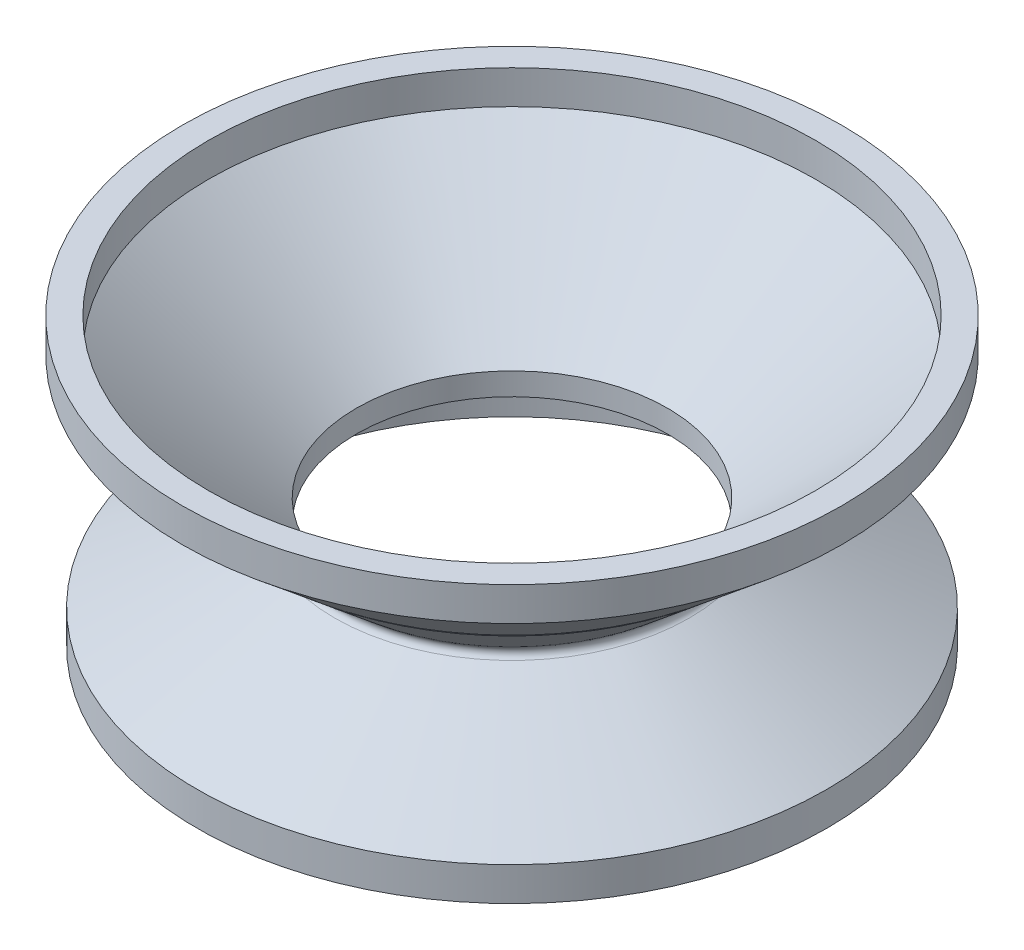
ISO-10303-21;
HEADER;
FILE_DESCRIPTION(('STEP AP214'),'2;1');
FILE_NAME('part.step','',(''),(''),'','','');
FILE_SCHEMA(('AUTOMOTIVE_DESIGN { 1 0 10303 214 1 1 1 1 }'));
ENDSEC;
DATA;
#1=APPLICATION_CONTEXT('core data for automotive mechanical design processes');
#2=APPLICATION_PROTOCOL_DEFINITION('international standard','automotive_design',2000,#1);
#3=PRODUCT_CONTEXT('',#1,'mechanical');
#4=PRODUCT('Part','Part','',(#3));
#5=PRODUCT_RELATED_PRODUCT_CATEGORY('part','',(#4));
#6=PRODUCT_DEFINITION_FORMATION('','',#4);
#7=PRODUCT_DEFINITION_CONTEXT('part definition',#1,'design');
#8=PRODUCT_DEFINITION('design','',#6,#7);
#9=PRODUCT_DEFINITION_SHAPE('','',#8);
#10=(LENGTH_UNIT() NAMED_UNIT(*) SI_UNIT(.MILLI.,.METRE.));
#11=(NAMED_UNIT(*) PLANE_ANGLE_UNIT() SI_UNIT($,.RADIAN.));
#12=(NAMED_UNIT(*) SI_UNIT($,.STERADIAN.) SOLID_ANGLE_UNIT());
#13=UNCERTAINTY_MEASURE_WITH_UNIT(LENGTH_MEASURE(1.E-05),#10,'distance_accuracy_value','');
#14=(GEOMETRIC_REPRESENTATION_CONTEXT(3) GLOBAL_UNCERTAINTY_ASSIGNED_CONTEXT((#13)) GLOBAL_UNIT_ASSIGNED_CONTEXT((#10,
#11,#12)) REPRESENTATION_CONTEXT('',''));
#15=CARTESIAN_POINT('',(0.,0.,0.));
#16=DIRECTION('',(0.,0.,1.));
#17=DIRECTION('',(1.,0.,0.));
#18=AXIS2_PLACEMENT_3D('',#15,#16,#17);
#19=CARTESIAN_POINT('',(10.6844770387406,0.,0.));
#20=DIRECTION('',(0.,-1.,0.));
#21=DIRECTION('',(1.,0.,0.));
#22=AXIS2_PLACEMENT_3D('',#19,#20,#21);
#23=CONICAL_SURFACE('',#22,10.0216950861066,1.0471975511966);
#24=CARTESIAN_POINT('',(10.6844770387406,-0.285629601348422,0.));
#25=DIRECTION('',(0.,-1.,0.));
#26=DIRECTION('',(1.,0.,0.));
#27=AXIS2_PLACEMENT_3D('',#24,#25,#26);
#28=CIRCLE('',#27,10.5164200677877);
#29=CARTESIAN_POINT('',(21.2008971065283,-0.28562960134842,0.));
#30=VERTEX_POINT('',#29);
#31=EDGE_CURVE('E11',#30,#30,#28,.T.);
#32=ORIENTED_EDGE('',*,*,#31,.T.);
#33=EDGE_LOOP('',(#32));
#34=FACE_BOUND('',#33,.T.);
#35=CARTESIAN_POINT('',(10.6844770387406,-5.,0.));
#36=DIRECTION('',(0.,-1.,0.));
#37=DIRECTION('',(1.,0.,0.));
#38=AXIS2_PLACEMENT_3D('',#35,#36,#37);
#39=CIRCLE('',#38,18.6819491239511);
#40=CARTESIAN_POINT('',(29.3664261626917,-5.,0.));
#41=VERTEX_POINT('',#40);
#42=EDGE_CURVE('E102',#41,#41,#39,.T.);
#43=ORIENTED_EDGE('',*,*,#42,.F.);
#44=EDGE_LOOP('',(#43));
#45=FACE_BOUND('',#44,.T.);
#46=ADVANCED_FACE('F45',(#34,#45),#23,.T.);
#47=CARTESIAN_POINT('',(10.6844770387406,3.9344166980199,0.));
#48=DIRECTION('',(0.,1.,0.));
#49=DIRECTION('',(-1.,0.,0.));
#50=AXIS2_PLACEMENT_3D('',#47,#48,#49);
#51=CONICAL_SURFACE('',#50,14.7105503207345,0.87266462599717);
#52=CARTESIAN_POINT('',(10.6844770387406,0.367198337412947,0.));
#53=DIRECTION('',(0.,1.,0.));
#54=DIRECTION('',(-1.,0.,0.));
#55=AXIS2_PLACEMENT_3D('',#52,#53,#54);
#56=CIRCLE('',#55,10.4593050239131);
#57=CARTESIAN_POINT('',(0.22517201482746,0.367198337412946,0.));
#58=VERTEX_POINT('',#57);
#59=EDGE_CURVE('E53',#58,#58,#56,.T.);
#60=ORIENTED_EDGE('',*,*,#59,.T.);
#61=EDGE_LOOP('',(#60));
#62=FACE_BOUND('',#61,.T.);
#63=CARTESIAN_POINT('',(10.6844770387406,3.9344166980199,0.));
#64=DIRECTION('',(0.,1.,0.));
#65=DIRECTION('',(-1.,0.,0.));
#66=AXIS2_PLACEMENT_3D('',#63,#64,#65);
#67=CIRCLE('',#66,14.7105503207345);
#68=CARTESIAN_POINT('',(-4.02607328199395,3.9344166980199,0.));
#69=VERTEX_POINT('',#68);
#70=EDGE_CURVE('E58',#69,#69,#67,.T.);
#71=ORIENTED_EDGE('',*,*,#70,.F.);
#72=EDGE_LOOP('',(#71));
#73=FACE_BOUND('',#72,.T.);
#74=ADVANCED_FACE('F134',(#62,#73),#51,.T.);
#75=CARTESIAN_POINT('',(10.6844770387406,7.60901803281973,0.));
#76=DIRECTION('',(0.,1.,0.));
#77=DIRECTION('',(-1.,0.,0.));
#78=AXIS2_PLACEMENT_3D('',#75,#76,#77);
#79=CYLINDRICAL_SURFACE('',#78,14.7105503207345);
#80=ORIENTED_EDGE('',*,*,#70,.T.);
#81=EDGE_LOOP('',(#80));
#82=FACE_BOUND('',#81,.T.);
#83=CARTESIAN_POINT('',(10.6844770387406,4.19549815588635,0.));
#84=DIRECTION('',(0.,1.,0.));
#85=DIRECTION('',(-1.,0.,0.));
#86=AXIS2_PLACEMENT_3D('',#83,#84,#85);
#87=CIRCLE('',#86,14.7105503207345);
#88=CARTESIAN_POINT('',(-4.02607328199395,4.19549815588635,0.));
#89=VERTEX_POINT('',#88);
#90=EDGE_CURVE('E63',#89,#89,#87,.T.);
#91=ORIENTED_EDGE('',*,*,#90,.F.);
#92=EDGE_LOOP('',(#91));
#93=FACE_BOUND('',#92,.T.);
#94=ADVANCED_FACE('F139',(#82,#93),#79,.T.);
#95=CARTESIAN_POINT('',(-4.33721804736603,4.19549815588635,0.));
#96=DIRECTION('',(0.,-1.,0.));
#97=DIRECTION('',(1.,0.,0.));
#98=AXIS2_PLACEMENT_3D('',#95,#96,#97);
#99=PLANE('',#98);
#100=ORIENTED_EDGE('',*,*,#90,.T.);
#101=EDGE_LOOP('',(#100));
#102=FACE_BOUND('',#101,.T.);
#103=CARTESIAN_POINT('',(10.6844770387406,4.19549815588635,0.));
#104=DIRECTION('',(0.,1.,0.));
#105=DIRECTION('',(-1.,0.,0.));
#106=AXIS2_PLACEMENT_3D('',#103,#104,#105);
#107=CIRCLE('',#106,15.0216950861066);
#108=CARTESIAN_POINT('',(-4.33721804736603,4.19549815588635,0.));
#109=VERTEX_POINT('',#108);
#110=EDGE_CURVE('E69',#109,#109,#107,.T.);
#111=ORIENTED_EDGE('',*,*,#110,.F.);
#112=EDGE_LOOP('',(#111));
#113=FACE_BOUND('',#112,.T.);
#114=ADVANCED_FACE('F145',(#102,#113),#99,.T.);
#115=CARTESIAN_POINT('',(10.6844770387406,8.,0.));
#116=DIRECTION('',(0.,1.,0.));
#117=DIRECTION('',(-1.,0.,0.));
#118=AXIS2_PLACEMENT_3D('',#115,#116,#117);
#119=CONICAL_SURFACE('',#118,19.5557238268604,0.87266462599717);
#120=ORIENTED_EDGE('',*,*,#110,.T.);
#121=EDGE_LOOP('',(#120));
#122=FACE_BOUND('',#121,.T.);
#123=CARTESIAN_POINT('',(10.6844770387406,8.,0.));
#124=DIRECTION('',(0.,1.,0.));
#125=DIRECTION('',(-1.,0.,0.));
#126=AXIS2_PLACEMENT_3D('',#123,#124,#125);
#127=CIRCLE('',#126,19.5557238268604);
#128=CARTESIAN_POINT('',(-8.87124678811982,8.,0.));
#129=VERTEX_POINT('',#128);
#130=EDGE_CURVE('E73',#129,#129,#127,.T.);
#131=ORIENTED_EDGE('',*,*,#130,.F.);
#132=EDGE_LOOP('',(#131));
#133=FACE_BOUND('',#132,.T.);
#134=ADVANCED_FACE('F149',(#122,#133),#119,.T.);
#135=CARTESIAN_POINT('',(10.6844770387406,0.634127584390457,0.));
#136=DIRECTION('',(0.,1.,0.));
#137=DIRECTION('',(-1.,0.,0.));
#138=AXIS2_PLACEMENT_3D('',#135,#136,#137);
#139=CONICAL_SURFACE('',#138,9.22169508610663,0.872664625997171);
#140=CARTESIAN_POINT('',(10.6844770387406,8.,0.));
#141=DIRECTION('',(0.,1.,0.));
#142=DIRECTION('',(-1.,0.,0.));
#143=AXIS2_PLACEMENT_3D('',#140,#141,#142);
#144=CIRCLE('',#143,18.);
#145=CARTESIAN_POINT('',(-7.3155229612594,8.,0.));
#146=VERTEX_POINT('',#145);
#147=EDGE_CURVE('E94',#146,#146,#144,.T.);
#148=ORIENTED_EDGE('',*,*,#147,.T.);
#149=EDGE_LOOP('',(#148));
#150=FACE_BOUND('',#149,.T.);
#151=CARTESIAN_POINT('',(10.6844770387406,0.634127584390457,0.));
#152=DIRECTION('',(0.,1.,0.));
#153=DIRECTION('',(-1.,0.,0.));
#154=AXIS2_PLACEMENT_3D('',#151,#152,#153);
#155=CIRCLE('',#154,9.22169508610663);
#156=CARTESIAN_POINT('',(1.46278195263397,0.634127584390456,0.));
#157=VERTEX_POINT('',#156);
#158=EDGE_CURVE('E77',#157,#157,#155,.T.);
#159=ORIENTED_EDGE('',*,*,#158,.F.);
#160=EDGE_LOOP('',(#159));
#161=FACE_BOUND('',#160,.T.);
#162=ADVANCED_FACE('F153',(#150,#161),#139,.F.);
#163=CARTESIAN_POINT('',(10.6844770387406,7.60901803281973,0.));
#164=DIRECTION('',(0.,1.,0.));
#165=DIRECTION('',(-1.,0.,0.));
#166=AXIS2_PLACEMENT_3D('',#163,#164,#165);
#167=CYLINDRICAL_SURFACE('',#166,9.22169508610663);
#168=ORIENTED_EDGE('',*,*,#158,.T.);
#169=EDGE_LOOP('',(#168));
#170=FACE_BOUND('',#169,.T.);
#171=CARTESIAN_POINT('',(10.6844770387406,-0.692820323027552,0.));
#172=DIRECTION('',(0.,1.,0.));
#173=DIRECTION('',(-1.,0.,0.));
#174=AXIS2_PLACEMENT_3D('',#171,#172,#173);
#175=CIRCLE('',#174,9.22169508610663);
#176=CARTESIAN_POINT('',(1.46278195263397,-0.692820323027553,0.));
#177=VERTEX_POINT('',#176);
#178=EDGE_CURVE('E81',#177,#177,#175,.T.);
#179=ORIENTED_EDGE('',*,*,#178,.F.);
#180=EDGE_LOOP('',(#179));
#181=FACE_BOUND('',#180,.T.);
#182=ADVANCED_FACE('F157',(#170,#181),#167,.F.);
#183=CARTESIAN_POINT('',(10.6844770387406,-5.,0.));
#184=DIRECTION('',(0.,-1.,0.));
#185=DIRECTION('',(1.,0.,0.));
#186=AXIS2_PLACEMENT_3D('',#183,#184,#185);
#187=CONICAL_SURFACE('',#186,16.6819491239511,1.0471975511966);
#188=ORIENTED_EDGE('',*,*,#178,.T.);
#189=EDGE_LOOP('',(#188));
#190=FACE_BOUND('',#189,.T.);
#191=CARTESIAN_POINT('',(10.6844770387406,-5.,0.));
#192=DIRECTION('',(0.,1.,0.));
#193=DIRECTION('',(-1.,0.,0.));
#194=AXIS2_PLACEMENT_3D('',#191,#192,#193);
#195=CIRCLE('',#194,16.6819491239511);
#196=CARTESIAN_POINT('',(-5.99747208521052,-5.,0.));
#197=VERTEX_POINT('',#196);
#198=EDGE_CURVE('E85',#197,#197,#195,.T.);
#199=ORIENTED_EDGE('',*,*,#198,.F.);
#200=EDGE_LOOP('',(#199));
#201=FACE_BOUND('',#200,.T.);
#202=ADVANCED_FACE('F161',(#190,#201),#187,.F.);
#203=CARTESIAN_POINT('',(10.6844770387406,0.0607805601653547,0.));
#204=DIRECTION('',(0.,1.,0.));
#205=DIRECTION('',(-1.,0.,0.));
#206=AXIS2_PLACEMENT_3D('',#203,#204,#205);
#207=TOROIDAL_SURFACE('',#206,10.7164200677877,0.4);
#208=ORIENTED_EDGE('',*,*,#31,.F.);
#209=EDGE_LOOP('',(#208));
#210=FACE_BOUND('',#209,.T.);
#211=ORIENTED_EDGE('',*,*,#59,.F.);
#212=EDGE_LOOP('',(#211));
#213=FACE_BOUND('',#212,.T.);
#214=ADVANCED_FACE('F47',(#210,#213),#207,.F.);
#215=CARTESIAN_POINT('',(10.6844770387406,10.,0.));
#216=DIRECTION('',(0.,1.,0.));
#217=DIRECTION('',(-1.,0.,0.));
#218=AXIS2_PLACEMENT_3D('',#215,#216,#217);
#219=PLANE('',#218);
#220=CARTESIAN_POINT('',(10.6844770387406,10.,0.));
#221=DIRECTION('',(0.,1.,0.));
#222=DIRECTION('',(-1.,0.,0.));
#223=AXIS2_PLACEMENT_3D('',#220,#221,#222);
#224=CIRCLE('',#223,19.5557238268604);
#225=CARTESIAN_POINT('',(-8.87124678811983,10.,0.));
#226=VERTEX_POINT('',#225);
#227=EDGE_CURVE('E89',#226,#226,#224,.T.);
#228=ORIENTED_EDGE('',*,*,#227,.T.);
#229=EDGE_LOOP('',(#228));
#230=FACE_BOUND('',#229,.T.);
#231=CARTESIAN_POINT('',(10.6844770387406,10.,0.));
#232=DIRECTION('',(0.,1.,0.));
#233=DIRECTION('',(-1.,0.,0.));
#234=AXIS2_PLACEMENT_3D('',#231,#232,#233);
#235=CIRCLE('',#234,18.);
#236=CARTESIAN_POINT('',(-7.3155229612594,10.,0.));
#237=VERTEX_POINT('',#236);
#238=EDGE_CURVE('E93',#237,#237,#235,.T.);
#239=ORIENTED_EDGE('',*,*,#238,.F.);
#240=EDGE_LOOP('',(#239));
#241=FACE_BOUND('',#240,.T.);
#242=ADVANCED_FACE('F167',(#230,#241),#219,.T.);
#243=CARTESIAN_POINT('',(10.6844770387406,10.,0.));
#244=DIRECTION('',(0.,-1.,0.));
#245=DIRECTION('',(1.,0.,0.));
#246=AXIS2_PLACEMENT_3D('',#243,#244,#245);
#247=CYLINDRICAL_SURFACE('',#246,19.5557238268604);
#248=ORIENTED_EDGE('',*,*,#227,.F.);
#249=EDGE_LOOP('',(#248));
#250=FACE_BOUND('',#249,.T.);
#251=ORIENTED_EDGE('',*,*,#130,.T.);
#252=EDGE_LOOP('',(#251));
#253=FACE_BOUND('',#252,.T.);
#254=ADVANCED_FACE('F129',(#250,#253),#247,.T.);
#255=CARTESIAN_POINT('',(10.6844770387406,10.,0.));
#256=DIRECTION('',(0.,-1.,0.));
#257=DIRECTION('',(1.,0.,0.));
#258=AXIS2_PLACEMENT_3D('',#255,#256,#257);
#259=CYLINDRICAL_SURFACE('',#258,18.);
#260=ORIENTED_EDGE('',*,*,#238,.T.);
#261=EDGE_LOOP('',(#260));
#262=FACE_BOUND('',#261,.T.);
#263=ORIENTED_EDGE('',*,*,#147,.F.);
#264=EDGE_LOOP('',(#263));
#265=FACE_BOUND('',#264,.T.);
#266=ADVANCED_FACE('F120',(#262,#265),#259,.F.);
#267=CARTESIAN_POINT('',(10.6844770387406,-6.99999999999999,0.));
#268=DIRECTION('',(0.,-1.,0.));
#269=DIRECTION('',(1.,0.,0.));
#270=AXIS2_PLACEMENT_3D('',#267,#268,#269);
#271=PLANE('',#270);
#272=CARTESIAN_POINT('',(10.6844770387406,-6.99999999999999,0.));
#273=DIRECTION('',(0.,-1.,0.));
#274=DIRECTION('',(1.,0.,0.));
#275=AXIS2_PLACEMENT_3D('',#272,#273,#274);
#276=CIRCLE('',#275,18.6819491239511);
#277=CARTESIAN_POINT('',(29.3664261626917,-6.99999999999999,0.));
#278=VERTEX_POINT('',#277);
#279=EDGE_CURVE('E98',#278,#278,#276,.T.);
#280=ORIENTED_EDGE('',*,*,#279,.T.);
#281=EDGE_LOOP('',(#280));
#282=FACE_BOUND('',#281,.T.);
#283=CARTESIAN_POINT('',(10.6844770387406,-6.99999999999999,0.));
#284=DIRECTION('',(0.,-1.,0.));
#285=DIRECTION('',(1.,0.,0.));
#286=AXIS2_PLACEMENT_3D('',#283,#284,#285);
#287=CIRCLE('',#286,16.6819491239511);
#288=CARTESIAN_POINT('',(27.3664261626917,-6.99999999999999,0.));
#289=VERTEX_POINT('',#288);
#290=EDGE_CURVE('E106',#289,#289,#287,.T.);
#291=ORIENTED_EDGE('',*,*,#290,.F.);
#292=EDGE_LOOP('',(#291));
#293=FACE_BOUND('',#292,.T.);
#294=ADVANCED_FACE('F117',(#282,#293),#271,.T.);
#295=CARTESIAN_POINT('',(10.6844770387406,-6.99999999999999,0.));
#296=DIRECTION('',(0.,1.,0.));
#297=DIRECTION('',(-1.,0.,0.));
#298=AXIS2_PLACEMENT_3D('',#295,#296,#297);
#299=CYLINDRICAL_SURFACE('',#298,18.6819491239511);
#300=ORIENTED_EDGE('',*,*,#279,.F.);
#301=EDGE_LOOP('',(#300));
#302=FACE_BOUND('',#301,.T.);
#303=ORIENTED_EDGE('',*,*,#42,.T.);
#304=EDGE_LOOP('',(#303));
#305=FACE_BOUND('',#304,.T.);
#306=ADVANCED_FACE('F119',(#302,#305),#299,.T.);
#307=CARTESIAN_POINT('',(10.6844770387406,-6.99999999999999,0.));
#308=DIRECTION('',(0.,1.,0.));
#309=DIRECTION('',(-1.,0.,0.));
#310=AXIS2_PLACEMENT_3D('',#307,#308,#309);
#311=CYLINDRICAL_SURFACE('',#310,16.6819491239511);
#312=ORIENTED_EDGE('',*,*,#290,.T.);
#313=EDGE_LOOP('',(#312));
#314=FACE_BOUND('',#313,.T.);
#315=ORIENTED_EDGE('',*,*,#198,.T.);
#316=EDGE_LOOP('',(#315));
#317=FACE_BOUND('',#316,.T.);
#318=ADVANCED_FACE('F114',(#314,#317),#311,.F.);
#319=CLOSED_SHELL('',(#46,#74,#94,#114,#134,#162,#182,#202,#214,#242,#254,#266,#294,#306,#318));
#320=MANIFOLD_SOLID_BREP('B2',#319);
#321=ADVANCED_BREP_SHAPE_REPRESENTATION('',(#18,#320),#14);
#322=SHAPE_DEFINITION_REPRESENTATION(#9,#321);
ENDSEC;
END-ISO-10303-21;
